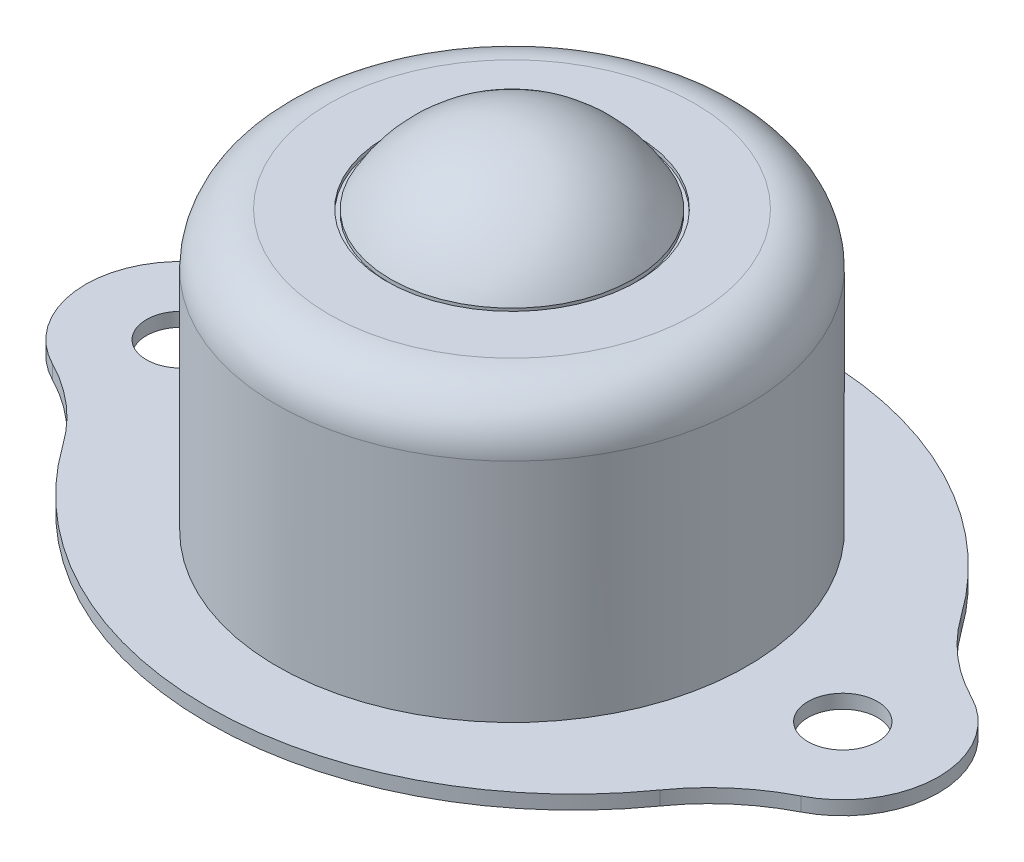
ISO-10303-21;
HEADER;
FILE_DESCRIPTION(('STEP AP214'),'2;1');
FILE_NAME('part.step','',(''),(''),'','','');
FILE_SCHEMA(('AUTOMOTIVE_DESIGN { 1 0 10303 214 1 1 1 1 }'));
ENDSEC;
DATA;
#1=APPLICATION_CONTEXT('core data for automotive mechanical design processes');
#2=APPLICATION_PROTOCOL_DEFINITION('international standard','automotive_design',2000,#1);
#3=PRODUCT_CONTEXT('',#1,'mechanical');
#4=PRODUCT('Part','Part','',(#3));
#5=PRODUCT_RELATED_PRODUCT_CATEGORY('part','',(#4));
#6=PRODUCT_DEFINITION_FORMATION('','',#4);
#7=PRODUCT_DEFINITION_CONTEXT('part definition',#1,'design');
#8=PRODUCT_DEFINITION('design','',#6,#7);
#9=PRODUCT_DEFINITION_SHAPE('','',#8);
#10=(LENGTH_UNIT() NAMED_UNIT(*) SI_UNIT(.MILLI.,.METRE.));
#11=(NAMED_UNIT(*) PLANE_ANGLE_UNIT() SI_UNIT($,.RADIAN.));
#12=(NAMED_UNIT(*) SI_UNIT($,.STERADIAN.) SOLID_ANGLE_UNIT());
#13=UNCERTAINTY_MEASURE_WITH_UNIT(LENGTH_MEASURE(1.E-05),#10,'distance_accuracy_value','');
#14=(GEOMETRIC_REPRESENTATION_CONTEXT(3) GLOBAL_UNCERTAINTY_ASSIGNED_CONTEXT((#13)) GLOBAL_UNIT_ASSIGNED_CONTEXT((#10,
#11,#12)) REPRESENTATION_CONTEXT('',''));
#15=CARTESIAN_POINT('',(0.,0.,0.));
#16=DIRECTION('',(0.,0.,1.));
#17=DIRECTION('',(1.,0.,0.));
#18=AXIS2_PLACEMENT_3D('',#15,#16,#17);
#19=CARTESIAN_POINT('',(0.,0.399999999999999,0.));
#20=DIRECTION('',(0.,-1.,0.));
#21=DIRECTION('',(1.,0.,0.));
#22=AXIS2_PLACEMENT_3D('',#19,#20,#21);
#23=PLANE('',#22);
#24=CARTESIAN_POINT('',(0.,0.400000000000001,0.));
#25=DIRECTION('',(0.,1.,0.));
#26=DIRECTION('',(-1.,0.,0.));
#27=AXIS2_PLACEMENT_3D('',#24,#25,#26);
#28=CIRCLE('',#27,13.5);
#29=CARTESIAN_POINT('',(-13.5,0.400000000000001,0.));
#30=VERTEX_POINT('',#29);
#31=EDGE_CURVE('E259',#30,#30,#28,.T.);
#32=ORIENTED_EDGE('',*,*,#31,.F.);
#33=EDGE_LOOP('',(#32));
#34=FACE_BOUND('',#33,.T.);
#35=CARTESIAN_POINT('',(19.,0.399999999999999,0.));
#36=DIRECTION('',(0.,-1.,0.));
#37=DIRECTION('',(1.,0.,0.));
#38=AXIS2_PLACEMENT_3D('',#35,#36,#37);
#39=CIRCLE('',#38,2.);
#40=CARTESIAN_POINT('',(21.,0.399999999999999,0.));
#41=VERTEX_POINT('',#40);
#42=EDGE_CURVE('E233',#41,#41,#39,.T.);
#43=ORIENTED_EDGE('',*,*,#42,.T.);
#44=EDGE_LOOP('',(#43));
#45=FACE_BOUND('',#44,.T.);
#46=CARTESIAN_POINT('',(-19.,0.399999999999999,0.));
#47=DIRECTION('',(0.,-1.,0.));
#48=DIRECTION('',(1.,0.,0.));
#49=AXIS2_PLACEMENT_3D('',#46,#47,#48);
#50=CIRCLE('',#49,2.);
#51=CARTESIAN_POINT('',(-17.,0.399999999999999,0.));
#52=VERTEX_POINT('',#51);
#53=EDGE_CURVE('E227',#52,#52,#50,.T.);
#54=ORIENTED_EDGE('',*,*,#53,.T.);
#55=EDGE_LOOP('',(#54));
#56=FACE_BOUND('',#55,.T.);
#57=CARTESIAN_POINT('',(19.,0.399999999999999,0.));
#58=DIRECTION('',(0.,-1.,0.));
#59=DIRECTION('',(1.,0.,0.));
#60=AXIS2_PLACEMENT_3D('',#57,#58,#59);
#61=CIRCLE('',#60,5.5);
#62=CARTESIAN_POINT('',(21.4937049116223,0.399999999999999,-4.90218683994711));
#63=VERTEX_POINT('',#62);
#64=CARTESIAN_POINT('',(21.4937049116223,0.399999999999999,4.90218683994711));
#65=VERTEX_POINT('',#64);
#66=EDGE_CURVE('E254',#63,#65,#61,.T.);
#67=ORIENTED_EDGE('',*,*,#66,.F.);
#68=CARTESIAN_POINT('',(26.9345156278892,0.399999999999999,-15.5978672180135));
#69=DIRECTION('',(0.,-1.,0.));
#70=DIRECTION('',(1.,0.,0.));
#71=AXIS2_PLACEMENT_3D('',#68,#69,#70);
#72=CIRCLE('',#71,12.);
#73=CARTESIAN_POINT('',(17.1520063754444,0.399999999999999,-8.64786630248612));
#74=VERTEX_POINT('',#73);
#75=EDGE_CURVE('E204',#74,#63,#72,.F.);
#76=ORIENTED_EDGE('',*,*,#75,.F.);
#77=CARTESIAN_POINT('',(0.,0.399999999999999,3.53780681432489));
#78=DIRECTION('',(0.,-1.,0.));
#79=DIRECTION('',(1.,0.,0.));
#80=AXIS2_PLACEMENT_3D('',#77,#78,#79);
#81=CIRCLE('',#80,21.0400083653276);
#82=CARTESIAN_POINT('',(-17.1520063754445,0.399999999999999,-8.64786630248611));
#83=VERTEX_POINT('',#82);
#84=EDGE_CURVE('E217',#83,#74,#81,.T.);
#85=ORIENTED_EDGE('',*,*,#84,.F.);
#86=CARTESIAN_POINT('',(-26.9345156278892,0.399999999999999,-15.5978672180135));
#87=DIRECTION('',(0.,-1.,0.));
#88=DIRECTION('',(1.,0.,0.));
#89=AXIS2_PLACEMENT_3D('',#86,#87,#88);
#90=CIRCLE('',#89,12.);
#91=CARTESIAN_POINT('',(-21.4937049116223,0.399999999999999,-4.90218683994711));
#92=VERTEX_POINT('',#91);
#93=EDGE_CURVE('E219',#83,#92,#90,.T.);
#94=ORIENTED_EDGE('',*,*,#93,.T.);
#95=CARTESIAN_POINT('',(-19.,0.399999999999999,0.));
#96=DIRECTION('',(0.,-1.,0.));
#97=DIRECTION('',(1.,0.,0.));
#98=AXIS2_PLACEMENT_3D('',#95,#96,#97);
#99=CIRCLE('',#98,5.5);
#100=CARTESIAN_POINT('',(-21.4937049116223,0.399999999999999,4.90218683994711));
#101=VERTEX_POINT('',#100);
#102=EDGE_CURVE('E256',#101,#92,#99,.T.);
#103=ORIENTED_EDGE('',*,*,#102,.F.);
#104=CARTESIAN_POINT('',(-26.9345156278892,0.399999999999999,15.5978672180135));
#105=DIRECTION('',(0.,-1.,0.));
#106=DIRECTION('',(1.,0.,0.));
#107=AXIS2_PLACEMENT_3D('',#104,#105,#106);
#108=CIRCLE('',#107,12.);
#109=CARTESIAN_POINT('',(-17.1520063754445,0.399999999999999,8.64786630248611));
#110=VERTEX_POINT('',#109);
#111=EDGE_CURVE('E138',#110,#101,#108,.F.);
#112=ORIENTED_EDGE('',*,*,#111,.F.);
#113=CARTESIAN_POINT('',(0.,0.399999999999999,-3.53780681432489));
#114=DIRECTION('',(0.,-1.,0.));
#115=DIRECTION('',(1.,0.,0.));
#116=AXIS2_PLACEMENT_3D('',#113,#114,#115);
#117=CIRCLE('',#116,21.0400083653276);
#118=CARTESIAN_POINT('',(17.1520063754445,0.399999999999999,8.64786630248611));
#119=VERTEX_POINT('',#118);
#120=EDGE_CURVE('E245',#110,#119,#117,.F.);
#121=ORIENTED_EDGE('',*,*,#120,.T.);
#122=CARTESIAN_POINT('',(26.9345156278892,0.399999999999999,15.5978672180135));
#123=DIRECTION('',(0.,-1.,0.));
#124=DIRECTION('',(1.,0.,0.));
#125=AXIS2_PLACEMENT_3D('',#122,#123,#124);
#126=CIRCLE('',#125,12.);
#127=EDGE_CURVE('E252',#65,#119,#126,.F.);
#128=ORIENTED_EDGE('',*,*,#127,.F.);
#129=EDGE_LOOP('',(#67,#76,#85,#94,#103,#112,#121,#128));
#130=FACE_BOUND('',#129,.T.);
#131=ADVANCED_FACE('F118',(#34,#45,#56,#130),#23,.F.);
#132=CARTESIAN_POINT('',(0.,-0.4,0.));
#133=DIRECTION('',(0.,-1.,0.));
#134=DIRECTION('',(1.,0.,0.));
#135=AXIS2_PLACEMENT_3D('',#132,#133,#134);
#136=PLANE('',#135);
#137=CARTESIAN_POINT('',(-19.,-0.4,0.));
#138=DIRECTION('',(0.,-1.,0.));
#139=DIRECTION('',(1.,0.,0.));
#140=AXIS2_PLACEMENT_3D('',#137,#138,#139);
#141=CIRCLE('',#140,2.);
#142=CARTESIAN_POINT('',(-17.,-0.4,0.));
#143=VERTEX_POINT('',#142);
#144=EDGE_CURVE('E224',#143,#143,#141,.T.);
#145=ORIENTED_EDGE('',*,*,#144,.F.);
#146=EDGE_LOOP('',(#145));
#147=FACE_BOUND('',#146,.T.);
#148=CARTESIAN_POINT('',(19.,-0.400000000000001,0.));
#149=DIRECTION('',(0.,-1.,0.));
#150=DIRECTION('',(1.,0.,0.));
#151=AXIS2_PLACEMENT_3D('',#148,#149,#150);
#152=CIRCLE('',#151,2.);
#153=CARTESIAN_POINT('',(21.,-0.400000000000001,0.));
#154=VERTEX_POINT('',#153);
#155=EDGE_CURVE('E230',#154,#154,#152,.T.);
#156=ORIENTED_EDGE('',*,*,#155,.F.);
#157=EDGE_LOOP('',(#156));
#158=FACE_BOUND('',#157,.T.);
#159=CARTESIAN_POINT('',(26.9345156278892,-0.400000000000001,-15.5978672180135));
#160=DIRECTION('',(0.,-1.,0.));
#161=DIRECTION('',(1.,0.,0.));
#162=AXIS2_PLACEMENT_3D('',#159,#160,#161);
#163=CIRCLE('',#162,12.);
#164=CARTESIAN_POINT('',(17.1520063754444,-0.400000000000001,-8.64786630248612));
#165=VERTEX_POINT('',#164);
#166=CARTESIAN_POINT('',(21.4937049116223,-0.400000000000001,-4.90218683994711));
#167=VERTEX_POINT('',#166);
#168=EDGE_CURVE('E201',#165,#167,#163,.F.);
#169=ORIENTED_EDGE('',*,*,#168,.T.);
#170=CARTESIAN_POINT('',(19.,-0.400000000000001,0.));
#171=DIRECTION('',(0.,-1.,0.));
#172=DIRECTION('',(1.,0.,0.));
#173=AXIS2_PLACEMENT_3D('',#170,#171,#172);
#174=CIRCLE('',#173,5.5);
#175=CARTESIAN_POINT('',(21.4937049116223,-0.400000000000001,4.90218683994711));
#176=VERTEX_POINT('',#175);
#177=EDGE_CURVE('E183',#167,#176,#174,.T.);
#178=ORIENTED_EDGE('',*,*,#177,.T.);
#179=CARTESIAN_POINT('',(26.9345156278892,-0.400000000000001,15.5978672180135));
#180=DIRECTION('',(0.,-1.,0.));
#181=DIRECTION('',(1.,0.,0.));
#182=AXIS2_PLACEMENT_3D('',#179,#180,#181);
#183=CIRCLE('',#182,12.);
#184=CARTESIAN_POINT('',(17.1520063754445,-0.400000000000001,8.64786630248611));
#185=VERTEX_POINT('',#184);
#186=EDGE_CURVE('E194',#176,#185,#183,.F.);
#187=ORIENTED_EDGE('',*,*,#186,.T.);
#188=CARTESIAN_POINT('',(0.,-0.4,-3.53780681432489));
#189=DIRECTION('',(0.,-1.,0.));
#190=DIRECTION('',(1.,0.,0.));
#191=AXIS2_PLACEMENT_3D('',#188,#189,#190);
#192=CIRCLE('',#191,21.0400083653276);
#193=CARTESIAN_POINT('',(-17.1520063754445,-0.400000000000001,8.64786630248611));
#194=VERTEX_POINT('',#193);
#195=EDGE_CURVE('E237',#194,#185,#192,.F.);
#196=ORIENTED_EDGE('',*,*,#195,.F.);
#197=CARTESIAN_POINT('',(-26.9345156278892,-0.4,15.5978672180135));
#198=DIRECTION('',(0.,-1.,0.));
#199=DIRECTION('',(1.,0.,0.));
#200=AXIS2_PLACEMENT_3D('',#197,#198,#199);
#201=CIRCLE('',#200,12.);
#202=CARTESIAN_POINT('',(-21.4937049116223,-0.4,4.90218683994711));
#203=VERTEX_POINT('',#202);
#204=EDGE_CURVE('E133',#194,#203,#201,.F.);
#205=ORIENTED_EDGE('',*,*,#204,.T.);
#206=CARTESIAN_POINT('',(-19.,-0.4,0.));
#207=DIRECTION('',(0.,-1.,0.));
#208=DIRECTION('',(1.,0.,0.));
#209=AXIS2_PLACEMENT_3D('',#206,#207,#208);
#210=CIRCLE('',#209,5.5);
#211=CARTESIAN_POINT('',(-21.4937049116223,-0.4,-4.90218683994711));
#212=VERTEX_POINT('',#211);
#213=EDGE_CURVE('E193',#203,#212,#210,.T.);
#214=ORIENTED_EDGE('',*,*,#213,.T.);
#215=CARTESIAN_POINT('',(-26.9345156278892,-0.4,-15.5978672180135));
#216=DIRECTION('',(0.,-1.,0.));
#217=DIRECTION('',(1.,0.,0.));
#218=AXIS2_PLACEMENT_3D('',#215,#216,#217);
#219=CIRCLE('',#218,12.);
#220=CARTESIAN_POINT('',(-17.1520063754445,-0.4,-8.64786630248611));
#221=VERTEX_POINT('',#220);
#222=EDGE_CURVE('E220',#221,#212,#219,.T.);
#223=ORIENTED_EDGE('',*,*,#222,.F.);
#224=CARTESIAN_POINT('',(0.,-0.4,3.53780681432489));
#225=DIRECTION('',(0.,-1.,0.));
#226=DIRECTION('',(1.,0.,0.));
#227=AXIS2_PLACEMENT_3D('',#224,#225,#226);
#228=CIRCLE('',#227,21.0400083653276);
#229=EDGE_CURVE('E211',#221,#165,#228,.T.);
#230=ORIENTED_EDGE('',*,*,#229,.T.);
#231=EDGE_LOOP('',(#169,#178,#187,#196,#205,#214,#223,#230));
#232=FACE_BOUND('',#231,.T.);
#233=ADVANCED_FACE('F208',(#147,#158,#232),#136,.T.);
#234=CARTESIAN_POINT('',(0.,20.6,0.));
#235=DIRECTION('',(0.,1.,0.));
#236=DIRECTION('',(-1.,0.,0.));
#237=AXIS2_PLACEMENT_3D('',#234,#235,#236);
#238=CYLINDRICAL_SURFACE('',#237,6.97997134664606);
#239=CARTESIAN_POINT('',(0.,16.1776811969494,0.));
#240=DIRECTION('',(0.,1.,0.));
#241=DIRECTION('',(-1.,0.,0.));
#242=AXIS2_PLACEMENT_3D('',#239,#240,#241);
#243=CIRCLE('',#242,6.97997134664606);
#244=CARTESIAN_POINT('',(-6.97997134664606,16.1776811969494,0.));
#245=VERTEX_POINT('',#244);
#246=EDGE_CURVE('E268',#245,#245,#243,.T.);
#247=ORIENTED_EDGE('',*,*,#246,.T.);
#248=EDGE_LOOP('',(#247));
#249=FACE_BOUND('',#248,.T.);
#250=CARTESIAN_POINT('',(0.,16.4,0.));
#251=DIRECTION('',(0.,1.,0.));
#252=DIRECTION('',(-1.,0.,0.));
#253=AXIS2_PLACEMENT_3D('',#250,#251,#252);
#254=CIRCLE('',#253,6.97997134664606);
#255=CARTESIAN_POINT('',(-6.97997134664606,16.4,0.));
#256=VERTEX_POINT('',#255);
#257=EDGE_CURVE('E271',#256,#256,#254,.T.);
#258=ORIENTED_EDGE('',*,*,#257,.F.);
#259=EDGE_LOOP('',(#258));
#260=FACE_BOUND('',#259,.T.);
#261=ADVANCED_FACE('F299',(#249,#260),#238,.T.);
#262=CARTESIAN_POINT('',(0.,16.1776811969494,0.));
#263=DIRECTION('',(0.,-1.,0.));
#264=DIRECTION('',(1.,0.,0.));
#265=AXIS2_PLACEMENT_3D('',#262,#263,#264);
#266=PLANE('',#265);
#267=ORIENTED_EDGE('',*,*,#246,.F.);
#268=EDGE_LOOP('',(#267));
#269=FACE_BOUND('',#268,.T.);
#270=CARTESIAN_POINT('',(0.,16.1776811969494,0.));
#271=DIRECTION('',(0.,1.,0.));
#272=DIRECTION('',(-1.,0.,0.));
#273=AXIS2_PLACEMENT_3D('',#270,#271,#272);
#274=CIRCLE('',#273,7.20555341386073);
#275=CARTESIAN_POINT('',(-7.20555341386073,16.1776811969494,0.));
#276=VERTEX_POINT('',#275);
#277=EDGE_CURVE('E265',#276,#276,#274,.T.);
#278=ORIENTED_EDGE('',*,*,#277,.T.);
#279=EDGE_LOOP('',(#278));
#280=FACE_BOUND('',#279,.T.);
#281=ADVANCED_FACE('F313',(#269,#280),#266,.F.);
#282=CARTESIAN_POINT('',(0.,20.6,0.));
#283=DIRECTION('',(0.,1.,0.));
#284=DIRECTION('',(-1.,0.,0.));
#285=AXIS2_PLACEMENT_3D('',#282,#283,#284);
#286=CYLINDRICAL_SURFACE('',#285,7.20555341386073);
#287=ORIENTED_EDGE('',*,*,#277,.F.);
#288=EDGE_LOOP('',(#287));
#289=FACE_BOUND('',#288,.T.);
#290=CARTESIAN_POINT('',(0.,16.4,0.));
#291=DIRECTION('',(0.,1.,0.));
#292=DIRECTION('',(-1.,0.,0.));
#293=AXIS2_PLACEMENT_3D('',#290,#291,#292);
#294=CIRCLE('',#293,7.20555341386073);
#295=CARTESIAN_POINT('',(-7.20555341386073,16.4,0.));
#296=VERTEX_POINT('',#295);
#297=EDGE_CURVE('E262',#296,#296,#294,.T.);
#298=ORIENTED_EDGE('',*,*,#297,.T.);
#299=EDGE_LOOP('',(#298));
#300=FACE_BOUND('',#299,.T.);
#301=ADVANCED_FACE('F310',(#289,#300),#286,.F.);
#302=CARTESIAN_POINT('',(0.,16.4,0.));
#303=DIRECTION('',(0.,-1.,0.));
#304=DIRECTION('',(1.,0.,0.));
#305=AXIS2_PLACEMENT_3D('',#302,#303,#304);
#306=PLANE('',#305);
#307=CARTESIAN_POINT('',(0.,16.4,0.));
#308=DIRECTION('',(0.,-1.,0.));
#309=DIRECTION('',(1.,0.,0.));
#310=AXIS2_PLACEMENT_3D('',#307,#308,#309);
#311=CIRCLE('',#310,10.5);
#312=CARTESIAN_POINT('',(10.5,16.4,0.));
#313=VERTEX_POINT('',#312);
#314=EDGE_CURVE('E126',#313,#313,#311,.F.);
#315=ORIENTED_EDGE('',*,*,#314,.T.);
#316=EDGE_LOOP('',(#315));
#317=FACE_BOUND('',#316,.T.);
#318=ORIENTED_EDGE('',*,*,#297,.F.);
#319=EDGE_LOOP('',(#318));
#320=FACE_BOUND('',#319,.T.);
#321=ADVANCED_FACE('F276',(#317,#320),#306,.F.);
#322=CARTESIAN_POINT('',(0.,20.6,0.));
#323=DIRECTION('',(0.,1.,0.));
#324=DIRECTION('',(-1.,0.,0.));
#325=AXIS2_PLACEMENT_3D('',#322,#323,#324);
#326=CYLINDRICAL_SURFACE('',#325,13.5);
#327=CARTESIAN_POINT('',(0.,13.4,0.));
#328=DIRECTION('',(0.,-1.,0.));
#329=DIRECTION('',(1.,0.,0.));
#330=AXIS2_PLACEMENT_3D('',#327,#328,#329);
#331=CIRCLE('',#330,13.5);
#332=CARTESIAN_POINT('',(13.5,13.4,0.));
#333=VERTEX_POINT('',#332);
#334=EDGE_CURVE('E12',#333,#333,#331,.T.);
#335=ORIENTED_EDGE('',*,*,#334,.T.);
#336=EDGE_LOOP('',(#335));
#337=FACE_BOUND('',#336,.T.);
#338=ORIENTED_EDGE('',*,*,#31,.T.);
#339=EDGE_LOOP('',(#338));
#340=FACE_BOUND('',#339,.T.);
#341=ADVANCED_FACE('F289',(#337,#340),#326,.T.);
#342=CARTESIAN_POINT('',(0.,12.7,0.));
#343=DIRECTION('',(0.,1.,0.));
#344=DIRECTION('',(1.,0.,0.));
#345=AXIS2_PLACEMENT_3D('',#342,#343,#344);
#346=SPHERICAL_SURFACE('',#345,7.9);
#347=ORIENTED_EDGE('',*,*,#257,.T.);
#348=EDGE_LOOP('',(#347));
#349=FACE_BOUND('',#348,.T.);
#350=ADVANCED_FACE('F281',(#349),#346,.T.);
#351=CARTESIAN_POINT('',(0.,13.4,0.));
#352=DIRECTION('',(0.,-1.,0.));
#353=DIRECTION('',(1.,0.,0.));
#354=AXIS2_PLACEMENT_3D('',#351,#352,#353);
#355=TOROIDAL_SURFACE('',#354,10.5,3.);
#356=ORIENTED_EDGE('',*,*,#334,.F.);
#357=EDGE_LOOP('',(#356));
#358=FACE_BOUND('',#357,.T.);
#359=ORIENTED_EDGE('',*,*,#314,.F.);
#360=EDGE_LOOP('',(#359));
#361=FACE_BOUND('',#360,.T.);
#362=ADVANCED_FACE('F120',(#358,#361),#355,.T.);
#363=CARTESIAN_POINT('',(-26.9345156278892,9.6,15.5978672180135));
#364=DIRECTION('',(0.,-1.,0.));
#365=DIRECTION('',(1.,0.,0.));
#366=AXIS2_PLACEMENT_3D('',#363,#364,#365);
#367=CYLINDRICAL_SURFACE('',#366,12.);
#368=ORIENTED_EDGE('',*,*,#111,.T.);
#369=DIRECTION('',(0.,-1.,0.));
#370=VECTOR('',#369,1.);
#371=CARTESIAN_POINT('',(-21.4937049116223,9.6,4.90218683994711));
#372=LINE('',#371,#370);
#373=EDGE_CURVE('E243',#101,#203,#372,.T.);
#374=ORIENTED_EDGE('',*,*,#373,.T.);
#375=ORIENTED_EDGE('',*,*,#204,.F.);
#376=DIRECTION('',(0.,-1.,0.));
#377=VECTOR('',#376,1.);
#378=CARTESIAN_POINT('',(-17.1520063754445,9.6,8.64786630248611));
#379=LINE('',#378,#377);
#380=EDGE_CURVE('E242',#110,#194,#379,.T.);
#381=ORIENTED_EDGE('',*,*,#380,.F.);
#382=EDGE_LOOP('',(#368,#374,#375,#381));
#383=FACE_BOUND('',#382,.T.);
#384=ADVANCED_FACE('F280',(#383),#367,.F.);
#385=CARTESIAN_POINT('',(-19.,9.6,0.));
#386=DIRECTION('',(0.,-1.,0.));
#387=DIRECTION('',(1.,0.,0.));
#388=AXIS2_PLACEMENT_3D('',#385,#386,#387);
#389=CYLINDRICAL_SURFACE('',#388,5.5);
#390=ORIENTED_EDGE('',*,*,#102,.T.);
#391=DIRECTION('',(0.,-1.,0.));
#392=VECTOR('',#391,1.);
#393=CARTESIAN_POINT('',(-21.4937049116223,9.6,-4.90218683994711));
#394=LINE('',#393,#392);
#395=EDGE_CURVE('E205',#92,#212,#394,.T.);
#396=ORIENTED_EDGE('',*,*,#395,.T.);
#397=ORIENTED_EDGE('',*,*,#213,.F.);
#398=ORIENTED_EDGE('',*,*,#373,.F.);
#399=EDGE_LOOP('',(#390,#396,#397,#398));
#400=FACE_BOUND('',#399,.T.);
#401=ADVANCED_FACE('F287',(#400),#389,.T.);
#402=CARTESIAN_POINT('',(19.,9.6,0.));
#403=DIRECTION('',(0.,-1.,0.));
#404=DIRECTION('',(1.,0.,0.));
#405=AXIS2_PLACEMENT_3D('',#402,#403,#404);
#406=CYLINDRICAL_SURFACE('',#405,5.5);
#407=ORIENTED_EDGE('',*,*,#66,.T.);
#408=DIRECTION('',(0.,-1.,0.));
#409=VECTOR('',#408,1.);
#410=CARTESIAN_POINT('',(21.4937049116223,9.6,4.90218683994711));
#411=LINE('',#410,#409);
#412=EDGE_CURVE('E188',#65,#176,#411,.T.);
#413=ORIENTED_EDGE('',*,*,#412,.T.);
#414=ORIENTED_EDGE('',*,*,#177,.F.);
#415=DIRECTION('',(0.,-1.,0.));
#416=VECTOR('',#415,1.);
#417=CARTESIAN_POINT('',(21.4937049116223,9.6,-4.90218683994711));
#418=LINE('',#417,#416);
#419=EDGE_CURVE('E186',#63,#167,#418,.T.);
#420=ORIENTED_EDGE('',*,*,#419,.F.);
#421=EDGE_LOOP('',(#407,#413,#414,#420));
#422=FACE_BOUND('',#421,.T.);
#423=ADVANCED_FACE('F185',(#422),#406,.T.);
#424=CARTESIAN_POINT('',(26.9345156278892,9.6,15.5978672180135));
#425=DIRECTION('',(0.,-1.,0.));
#426=DIRECTION('',(1.,0.,0.));
#427=AXIS2_PLACEMENT_3D('',#424,#425,#426);
#428=CYLINDRICAL_SURFACE('',#427,12.);
#429=ORIENTED_EDGE('',*,*,#127,.T.);
#430=DIRECTION('',(0.,-1.,0.));
#431=VECTOR('',#430,1.);
#432=CARTESIAN_POINT('',(17.1520063754445,9.6,8.64786630248611));
#433=LINE('',#432,#431);
#434=EDGE_CURVE('E247',#119,#185,#433,.T.);
#435=ORIENTED_EDGE('',*,*,#434,.T.);
#436=ORIENTED_EDGE('',*,*,#186,.F.);
#437=ORIENTED_EDGE('',*,*,#412,.F.);
#438=EDGE_LOOP('',(#429,#435,#436,#437));
#439=FACE_BOUND('',#438,.T.);
#440=ADVANCED_FACE('F390',(#439),#428,.F.);
#441=CARTESIAN_POINT('',(0.,9.6,-3.53780681432489));
#442=DIRECTION('',(0.,-1.,0.));
#443=DIRECTION('',(1.,0.,0.));
#444=AXIS2_PLACEMENT_3D('',#441,#442,#443);
#445=CYLINDRICAL_SURFACE('',#444,21.0400083653276);
#446=ORIENTED_EDGE('',*,*,#380,.T.);
#447=ORIENTED_EDGE('',*,*,#195,.T.);
#448=ORIENTED_EDGE('',*,*,#434,.F.);
#449=ORIENTED_EDGE('',*,*,#120,.F.);
#450=EDGE_LOOP('',(#446,#447,#448,#449));
#451=FACE_BOUND('',#450,.T.);
#452=ADVANCED_FACE('F401',(#451),#445,.T.);
#453=CARTESIAN_POINT('',(19.,9.6,0.));
#454=DIRECTION('',(0.,-1.,0.));
#455=DIRECTION('',(1.,0.,0.));
#456=AXIS2_PLACEMENT_3D('',#453,#454,#455);
#457=CYLINDRICAL_SURFACE('',#456,2.);
#458=ORIENTED_EDGE('',*,*,#155,.T.);
#459=EDGE_LOOP('',(#458));
#460=FACE_BOUND('',#459,.T.);
#461=ORIENTED_EDGE('',*,*,#42,.F.);
#462=EDGE_LOOP('',(#461));
#463=FACE_BOUND('',#462,.T.);
#464=ADVANCED_FACE('F410',(#460,#463),#457,.F.);
#465=CARTESIAN_POINT('',(-19.,9.6,0.));
#466=DIRECTION('',(0.,-1.,0.));
#467=DIRECTION('',(1.,0.,0.));
#468=AXIS2_PLACEMENT_3D('',#465,#466,#467);
#469=CYLINDRICAL_SURFACE('',#468,2.);
#470=ORIENTED_EDGE('',*,*,#144,.T.);
#471=EDGE_LOOP('',(#470));
#472=FACE_BOUND('',#471,.T.);
#473=ORIENTED_EDGE('',*,*,#53,.F.);
#474=EDGE_LOOP('',(#473));
#475=FACE_BOUND('',#474,.T.);
#476=ADVANCED_FACE('F419',(#472,#475),#469,.F.);
#477=CARTESIAN_POINT('',(26.9345156278892,9.6,-15.5978672180135));
#478=DIRECTION('',(0.,-1.,0.));
#479=DIRECTION('',(1.,0.,0.));
#480=AXIS2_PLACEMENT_3D('',#477,#478,#479);
#481=CYLINDRICAL_SURFACE('',#480,12.);
#482=ORIENTED_EDGE('',*,*,#75,.T.);
#483=ORIENTED_EDGE('',*,*,#419,.T.);
#484=ORIENTED_EDGE('',*,*,#168,.F.);
#485=DIRECTION('',(0.,-1.,0.));
#486=VECTOR('',#485,1.);
#487=CARTESIAN_POINT('',(17.1520063754444,9.6,-8.64786630248612));
#488=LINE('',#487,#486);
#489=EDGE_CURVE('E206',#74,#165,#488,.T.);
#490=ORIENTED_EDGE('',*,*,#489,.F.);
#491=EDGE_LOOP('',(#482,#483,#484,#490));
#492=FACE_BOUND('',#491,.T.);
#493=ADVANCED_FACE('F199',(#492),#481,.F.);
#494=CARTESIAN_POINT('',(-26.9345156278892,9.6,-15.5978672180135));
#495=DIRECTION('',(0.,-1.,0.));
#496=DIRECTION('',(1.,0.,0.));
#497=AXIS2_PLACEMENT_3D('',#494,#495,#496);
#498=CYLINDRICAL_SURFACE('',#497,12.);
#499=DIRECTION('',(0.,-1.,0.));
#500=VECTOR('',#499,1.);
#501=CARTESIAN_POINT('',(-17.1520063754445,9.6,-8.64786630248611));
#502=LINE('',#501,#500);
#503=EDGE_CURVE('E467',#83,#221,#502,.T.);
#504=ORIENTED_EDGE('',*,*,#503,.T.);
#505=ORIENTED_EDGE('',*,*,#222,.T.);
#506=ORIENTED_EDGE('',*,*,#395,.F.);
#507=ORIENTED_EDGE('',*,*,#93,.F.);
#508=EDGE_LOOP('',(#504,#505,#506,#507));
#509=FACE_BOUND('',#508,.T.);
#510=ADVANCED_FACE('F436',(#509),#498,.F.);
#511=CARTESIAN_POINT('',(0.,9.6,3.53780681432489));
#512=DIRECTION('',(0.,-1.,0.));
#513=DIRECTION('',(1.,0.,0.));
#514=AXIS2_PLACEMENT_3D('',#511,#512,#513);
#515=CYLINDRICAL_SURFACE('',#514,21.0400083653276);
#516=ORIENTED_EDGE('',*,*,#84,.T.);
#517=ORIENTED_EDGE('',*,*,#489,.T.);
#518=ORIENTED_EDGE('',*,*,#229,.F.);
#519=ORIENTED_EDGE('',*,*,#503,.F.);
#520=EDGE_LOOP('',(#516,#517,#518,#519));
#521=FACE_BOUND('',#520,.T.);
#522=ADVANCED_FACE('F444',(#521),#515,.T.);
#523=CLOSED_SHELL('',(#131,#233,#261,#281,#301,#321,#341,#350,#362,#384,#401,#423,#440,#452,
#464,#476,#493,#510,#522));
#524=MANIFOLD_SOLID_BREP('B2',#523);
#525=ADVANCED_BREP_SHAPE_REPRESENTATION('',(#18,#524),#14);
#526=SHAPE_DEFINITION_REPRESENTATION(#9,#525);
ENDSEC;
END-ISO-10303-21;
